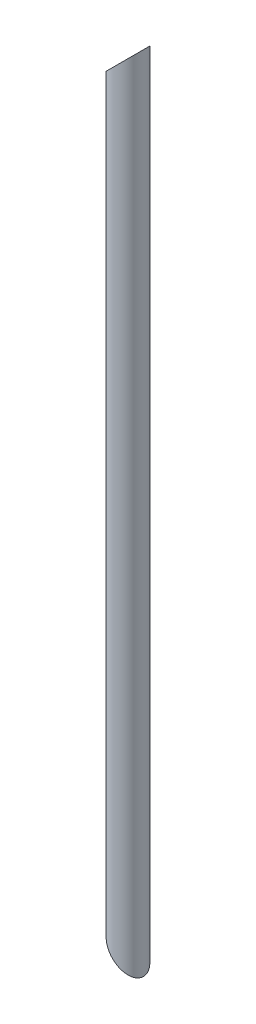
ISO-10303-21;
HEADER;
FILE_DESCRIPTION(('STEP AP214'),'2;1');
FILE_NAME('part.step','',(''),(''),'','','');
FILE_SCHEMA(('AUTOMOTIVE_DESIGN { 1 0 10303 214 1 1 1 1 }'));
ENDSEC;
DATA;
#1=APPLICATION_CONTEXT('core data for automotive mechanical design processes');
#2=APPLICATION_PROTOCOL_DEFINITION('international standard','automotive_design',2000,#1);
#3=PRODUCT_CONTEXT('',#1,'mechanical');
#4=PRODUCT('Part','Part','',(#3));
#5=PRODUCT_RELATED_PRODUCT_CATEGORY('part','',(#4));
#6=PRODUCT_DEFINITION_FORMATION('','',#4);
#7=PRODUCT_DEFINITION_CONTEXT('part definition',#1,'design');
#8=PRODUCT_DEFINITION('design','',#6,#7);
#9=PRODUCT_DEFINITION_SHAPE('','',#8);
#10=(LENGTH_UNIT() NAMED_UNIT(*) SI_UNIT(.MILLI.,.METRE.));
#11=(NAMED_UNIT(*) PLANE_ANGLE_UNIT() SI_UNIT($,.RADIAN.));
#12=(NAMED_UNIT(*) SI_UNIT($,.STERADIAN.) SOLID_ANGLE_UNIT());
#13=UNCERTAINTY_MEASURE_WITH_UNIT(LENGTH_MEASURE(1.E-05),#10,'distance_accuracy_value','');
#14=(GEOMETRIC_REPRESENTATION_CONTEXT(3) GLOBAL_UNCERTAINTY_ASSIGNED_CONTEXT((#13)) GLOBAL_UNIT_ASSIGNED_CONTEXT((#10,
#11,#12)) REPRESENTATION_CONTEXT('',''));
#15=CARTESIAN_POINT('',(0.,0.,0.));
#16=DIRECTION('',(0.,0.,1.));
#17=DIRECTION('',(1.,0.,0.));
#18=AXIS2_PLACEMENT_3D('',#15,#16,#17);
#19=CARTESIAN_POINT('',(0.,0.,0.));
#20=DIRECTION('',(0.,-1.,0.));
#21=DIRECTION('',(1.,0.,0.));
#22=AXIS2_PLACEMENT_3D('',#19,#20,#21);
#23=CYLINDRICAL_SURFACE('',#22,31.7500000000001);
#24=CARTESIAN_POINT('',(-4.9679221174536E-13,1618.25,0.));
#25=DIRECTION('',(0.707106781186547,-0.707106781186548,0.));
#26=DIRECTION('',(-0.707106781186548,-0.707106781186547,0.));
#27=AXIS2_PLACEMENT_3D('',#24,#25,#26);
#28=ELLIPSE('',#27,44.9012806053459,31.7500000000001);
#29=CARTESIAN_POINT('',(-31.7500000000006,1586.5,0.));
#30=VERTEX_POINT('',#29);
#31=EDGE_CURVE('E45',#30,#30,#28,.F.);
#32=ORIENTED_EDGE('',*,*,#31,.F.);
#33=EDGE_LOOP('',(#32));
#34=FACE_BOUND('',#33,.T.);
#35=CARTESIAN_POINT('',(0.,31.7499999999999,0.));
#36=DIRECTION('',(0.707106781186545,0.70710678118655,0.));
#37=DIRECTION('',(0.70710678118655,-0.707106781186545,0.));
#38=AXIS2_PLACEMENT_3D('',#35,#36,#37);
#39=ELLIPSE('',#38,44.9012806053457,31.7500000000001);
#40=CARTESIAN_POINT('',(31.7500000000001,0.,0.));
#41=VERTEX_POINT('',#40);
#42=EDGE_CURVE('E10',#41,#41,#39,.F.);
#43=ORIENTED_EDGE('',*,*,#42,.F.);
#44=EDGE_LOOP('',(#43));
#45=FACE_BOUND('',#44,.T.);
#46=ADVANCED_FACE('F37',(#34,#45),#23,.T.);
#47=CARTESIAN_POINT('',(31.7500000000001,0.,-31.7500000000002));
#48=DIRECTION('',(0.707106781186545,0.70710678118655,0.));
#49=DIRECTION('',(-0.70710678118655,0.707106781186545,0.));
#50=AXIS2_PLACEMENT_3D('',#47,#48,#49);
#51=PLANE('',#50);
#52=CARTESIAN_POINT('',(0.,31.7499999999999,0.));
#53=DIRECTION('',(0.707106781186545,0.70710678118655,0.));
#54=DIRECTION('',(0.70710678118655,-0.707106781186545,0.));
#55=AXIS2_PLACEMENT_3D('',#52,#53,#54);
#56=ELLIPSE('',#55,43.4870670429725,30.75);
#57=CARTESIAN_POINT('',(30.75,1.00000000000019,0.));
#58=VERTEX_POINT('',#57);
#59=EDGE_CURVE('E50',#58,#58,#56,.F.);
#60=ORIENTED_EDGE('',*,*,#59,.F.);
#61=EDGE_LOOP('',(#60));
#62=FACE_BOUND('',#61,.T.);
#63=ORIENTED_EDGE('',*,*,#42,.T.);
#64=EDGE_LOOP('',(#63));
#65=FACE_BOUND('',#64,.T.);
#66=ADVANCED_FACE('F66',(#62,#65),#51,.F.);
#67=CARTESIAN_POINT('',(31.7499999999996,1650.,-31.7500000000002));
#68=DIRECTION('',(0.707106781186547,-0.707106781186548,0.));
#69=DIRECTION('',(0.707106781186548,0.707106781186547,0.));
#70=AXIS2_PLACEMENT_3D('',#67,#68,#69);
#71=PLANE('',#70);
#72=CARTESIAN_POINT('',(0.,1618.25,0.));
#73=DIRECTION('',(0.707106781186547,-0.707106781186548,0.));
#74=DIRECTION('',(-0.707106781186548,-0.707106781186547,0.));
#75=AXIS2_PLACEMENT_3D('',#72,#73,#74);
#76=ELLIPSE('',#75,43.4870670429726,30.75);
#77=CARTESIAN_POINT('',(-30.75,1587.5,0.));
#78=VERTEX_POINT('',#77);
#79=EDGE_CURVE('E40',#78,#78,#76,.F.);
#80=ORIENTED_EDGE('',*,*,#79,.F.);
#81=EDGE_LOOP('',(#80));
#82=FACE_BOUND('',#81,.T.);
#83=ORIENTED_EDGE('',*,*,#31,.T.);
#84=EDGE_LOOP('',(#83));
#85=FACE_BOUND('',#84,.T.);
#86=ADVANCED_FACE('F63',(#82,#85),#71,.F.);
#87=CARTESIAN_POINT('',(0.,1650.,0.));
#88=DIRECTION('',(0.,-1.,0.));
#89=DIRECTION('',(0.,0.,-1.));
#90=AXIS2_PLACEMENT_3D('',#87,#88,#89);
#91=CYLINDRICAL_SURFACE('',#90,30.75);
#92=ORIENTED_EDGE('',*,*,#79,.T.);
#93=EDGE_LOOP('',(#92));
#94=FACE_BOUND('',#93,.T.);
#95=ORIENTED_EDGE('',*,*,#59,.T.);
#96=EDGE_LOOP('',(#95));
#97=FACE_BOUND('',#96,.T.);
#98=ADVANCED_FACE('F61',(#94,#97),#91,.F.);
#99=CLOSED_SHELL('',(#46,#66,#86,#98));
#100=MANIFOLD_SOLID_BREP('B2',#99);
#101=ADVANCED_BREP_SHAPE_REPRESENTATION('',(#18,#100),#14);
#102=SHAPE_DEFINITION_REPRESENTATION(#9,#101);
ENDSEC;
END-ISO-10303-21;
